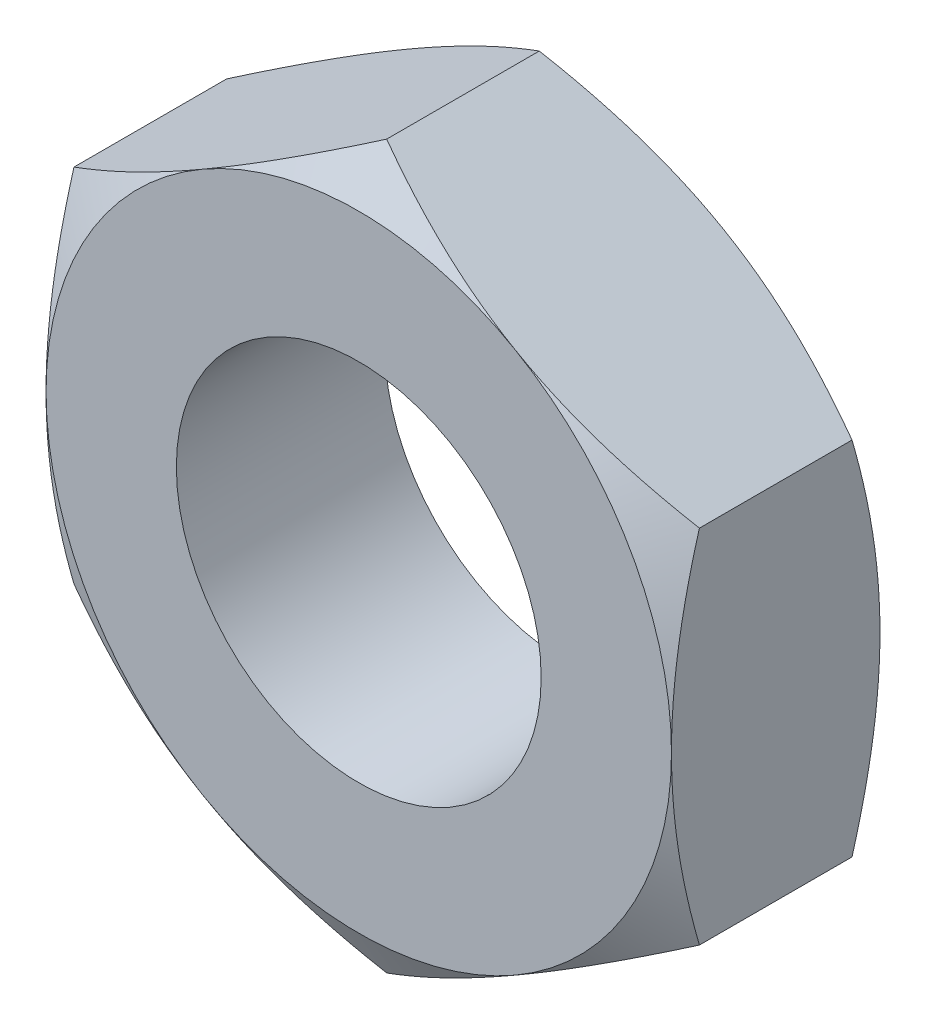
ISO-10303-21;
HEADER;
FILE_DESCRIPTION(('STEP AP214'),'2;1');
FILE_NAME('part.step','',(''),(''),'','','');
FILE_SCHEMA(('AUTOMOTIVE_DESIGN { 1 0 10303 214 1 1 1 1 }'));
ENDSEC;
DATA;
#1=APPLICATION_CONTEXT('core data for automotive mechanical design processes');
#2=APPLICATION_PROTOCOL_DEFINITION('international standard','automotive_design',2000,#1);
#3=PRODUCT_CONTEXT('',#1,'mechanical');
#4=PRODUCT('Part','Part','',(#3));
#5=PRODUCT_RELATED_PRODUCT_CATEGORY('part','',(#4));
#6=PRODUCT_DEFINITION_FORMATION('','',#4);
#7=PRODUCT_DEFINITION_CONTEXT('part definition',#1,'design');
#8=PRODUCT_DEFINITION('design','',#6,#7);
#9=PRODUCT_DEFINITION_SHAPE('','',#8);
#10=(LENGTH_UNIT() NAMED_UNIT(*) SI_UNIT(.MILLI.,.METRE.));
#11=(NAMED_UNIT(*) PLANE_ANGLE_UNIT() SI_UNIT($,.RADIAN.));
#12=(NAMED_UNIT(*) SI_UNIT($,.STERADIAN.) SOLID_ANGLE_UNIT());
#13=UNCERTAINTY_MEASURE_WITH_UNIT(LENGTH_MEASURE(1.E-05),#10,'distance_accuracy_value','');
#14=(GEOMETRIC_REPRESENTATION_CONTEXT(3) GLOBAL_UNCERTAINTY_ASSIGNED_CONTEXT((#13)) GLOBAL_UNIT_ASSIGNED_CONTEXT((#10,
#11,#12)) REPRESENTATION_CONTEXT('',''));
#15=CARTESIAN_POINT('',(0.,0.,0.));
#16=DIRECTION('',(0.,0.,1.));
#17=DIRECTION('',(1.,0.,0.));
#18=AXIS2_PLACEMENT_3D('',#15,#16,#17);
#19=CARTESIAN_POINT('',(0.,0.,-1.));
#20=DIRECTION('',(0.,0.,1.));
#21=DIRECTION('',(1.,0.,0.));
#22=AXIS2_PLACEMENT_3D('',#19,#20,#21);
#23=PLANE('',#22);
#24=CARTESIAN_POINT('',(0.,0.,-1.));
#25=DIRECTION('',(0.,0.,1.));
#26=DIRECTION('',(1.,0.,0.));
#27=AXIS2_PLACEMENT_3D('',#24,#25,#26);
#28=CIRCLE('',#27,1.75);
#29=CARTESIAN_POINT('',(1.75,0.,-1.));
#30=VERTEX_POINT('',#29);
#31=EDGE_CURVE('E250',#30,#30,#28,.T.);
#32=ORIENTED_EDGE('',*,*,#31,.T.);
#33=EDGE_LOOP('',(#32));
#34=FACE_BOUND('',#33,.T.);
#35=CARTESIAN_POINT('',(0.,0.,-1.));
#36=DIRECTION('',(0.,0.,1.));
#37=DIRECTION('',(1.,0.,0.));
#38=AXIS2_PLACEMENT_3D('',#35,#36,#37);
#39=CIRCLE('',#38,3.);
#40=CARTESIAN_POINT('',(3.,0.,-1.));
#41=VERTEX_POINT('',#40);
#42=CARTESIAN_POINT('',(1.5,2.59807621135332,-1.));
#43=VERTEX_POINT('',#42);
#44=EDGE_CURVE('E131',#41,#43,#39,.T.);
#45=ORIENTED_EDGE('',*,*,#44,.F.);
#46=CARTESIAN_POINT('',(0.,0.,-1.));
#47=DIRECTION('',(0.,0.,1.));
#48=DIRECTION('',(1.,0.,0.));
#49=AXIS2_PLACEMENT_3D('',#46,#47,#48);
#50=CIRCLE('',#49,3.);
#51=CARTESIAN_POINT('',(1.5,-2.59807621135332,-1.));
#52=VERTEX_POINT('',#51);
#53=EDGE_CURVE('E12',#41,#52,#50,.F.);
#54=ORIENTED_EDGE('',*,*,#53,.T.);
#55=CARTESIAN_POINT('',(-1.5,-2.59807621135332,-1.));
#56=VERTEX_POINT('',#55);
#57=EDGE_CURVE('E43',#52,#56,#50,.F.);
#58=ORIENTED_EDGE('',*,*,#57,.T.);
#59=CARTESIAN_POINT('',(-3.,0.,-1.));
#60=VERTEX_POINT('',#59);
#61=EDGE_CURVE('E309',#56,#60,#50,.F.);
#62=ORIENTED_EDGE('',*,*,#61,.T.);
#63=CARTESIAN_POINT('',(-1.5,2.59807621135332,-1.));
#64=VERTEX_POINT('',#63);
#65=EDGE_CURVE('E143',#60,#64,#50,.F.);
#66=ORIENTED_EDGE('',*,*,#65,.T.);
#67=EDGE_CURVE('E44',#64,#43,#50,.F.);
#68=ORIENTED_EDGE('',*,*,#67,.T.);
#69=EDGE_LOOP('',(#45,#54,#58,#62,#66,#68));
#70=FACE_BOUND('',#69,.T.);
#71=ADVANCED_FACE('F34',(#34,#70),#23,.F.);
#72=CARTESIAN_POINT('',(0.,0.,1.));
#73=DIRECTION('',(0.,0.,1.));
#74=DIRECTION('',(1.,0.,0.));
#75=AXIS2_PLACEMENT_3D('',#72,#73,#74);
#76=PLANE('',#75);
#77=CARTESIAN_POINT('',(0.,0.,1.));
#78=DIRECTION('',(0.,0.,1.));
#79=DIRECTION('',(1.,0.,0.));
#80=AXIS2_PLACEMENT_3D('',#77,#78,#79);
#81=CIRCLE('',#80,1.75);
#82=CARTESIAN_POINT('',(1.75,0.,1.));
#83=VERTEX_POINT('',#82);
#84=EDGE_CURVE('E246',#83,#83,#81,.T.);
#85=ORIENTED_EDGE('',*,*,#84,.F.);
#86=EDGE_LOOP('',(#85));
#87=FACE_BOUND('',#86,.T.);
#88=CARTESIAN_POINT('',(0.,0.,1.));
#89=DIRECTION('',(0.,0.,1.));
#90=DIRECTION('',(1.,0.,0.));
#91=AXIS2_PLACEMENT_3D('',#88,#89,#90);
#92=CIRCLE('',#91,3.);
#93=CARTESIAN_POINT('',(1.5,-2.59807621135332,1.));
#94=VERTEX_POINT('',#93);
#95=CARTESIAN_POINT('',(3.,0.,1.));
#96=VERTEX_POINT('',#95);
#97=EDGE_CURVE('E291',#94,#96,#92,.T.);
#98=ORIENTED_EDGE('',*,*,#97,.T.);
#99=CARTESIAN_POINT('',(1.5,2.59807621135332,1.));
#100=VERTEX_POINT('',#99);
#101=EDGE_CURVE('E280',#96,#100,#92,.T.);
#102=ORIENTED_EDGE('',*,*,#101,.T.);
#103=CARTESIAN_POINT('',(-1.5,2.59807621135332,1.));
#104=VERTEX_POINT('',#103);
#105=EDGE_CURVE('E284',#100,#104,#92,.T.);
#106=ORIENTED_EDGE('',*,*,#105,.T.);
#107=CARTESIAN_POINT('',(-3.,0.,1.));
#108=VERTEX_POINT('',#107);
#109=EDGE_CURVE('E288',#104,#108,#92,.T.);
#110=ORIENTED_EDGE('',*,*,#109,.T.);
#111=CARTESIAN_POINT('',(-1.5,-2.59807621135332,1.));
#112=VERTEX_POINT('',#111);
#113=EDGE_CURVE('E294',#108,#112,#92,.T.);
#114=ORIENTED_EDGE('',*,*,#113,.T.);
#115=EDGE_CURVE('E293',#112,#94,#92,.T.);
#116=ORIENTED_EDGE('',*,*,#115,.T.);
#117=EDGE_LOOP('',(#98,#102,#106,#110,#114,#116));
#118=FACE_BOUND('',#117,.T.);
#119=ADVANCED_FACE('F289',(#87,#118),#76,.T.);
#120=CARTESIAN_POINT('',(0.,3.46410161513776,1.));
#121=DIRECTION('',(0.5,-0.866025403784439,0.));
#122=DIRECTION('',(0.866025403784438,0.5,0.));
#123=AXIS2_PLACEMENT_3D('',#120,#121,#122);
#124=PLANE('',#123);
#125=DIRECTION('',(0.,0.,-1.));
#126=VECTOR('',#125,1.);
#127=CARTESIAN_POINT('',(0.,3.46410161513776,1.));
#128=LINE('',#127,#126);
#129=CARTESIAN_POINT('',(0.,3.46410161513776,0.732050807568878));
#130=VERTEX_POINT('',#129);
#131=CARTESIAN_POINT('',(0.,3.46410161513776,-0.732050807568878));
#132=VERTEX_POINT('',#131);
#133=EDGE_CURVE('E249',#130,#132,#128,.T.);
#134=ORIENTED_EDGE('',*,*,#133,.T.);
#135=CARTESIAN_POINT('',(0.000200000000000336,3.4642170851916,-0.731984137568989));
#136=CARTESIAN_POINT('',(-0.131635206588332,3.38810199317915,-0.775946295547693));
#137=CARTESIAN_POINT('',(-0.264608405355249,3.31132988107607,-0.815928413707371));
#138=CARTESIAN_POINT('',(-0.532857420002055,3.15645624025988,-0.885717919554534));
#139=CARTESIAN_POINT('',(-0.668138002634341,3.078351959461,-0.915500617734619));
#140=CARTESIAN_POINT('',(-0.937022602096483,2.92311136358059,-0.961862160788745));
#141=CARTESIAN_POINT('',(-1.07058524542946,2.84599893549862,-0.97874955887705));
#142=CARTESIAN_POINT('',(-1.33833905729569,2.6914112001411,-0.998910357551475));
#143=CARTESIAN_POINT('',(-1.47252925247984,2.61393645482892,-1.00220045221892));
#144=CARTESIAN_POINT('',(-1.72327559769581,2.46916798492017,-0.995359469114609));
#145=CARTESIAN_POINT('',(-1.83986926497268,2.40185259973206,-0.986908085807383));
#146=CARTESIAN_POINT('',(-2.07229698497464,2.2676603930218,-0.960121056992965));
#147=CARTESIAN_POINT('',(-2.18813023365133,2.2007840357172,-0.941776259138288));
#148=CARTESIAN_POINT('',(-2.42103725705637,2.06631510305815,-0.895915249146673));
#149=CARTESIAN_POINT('',(-2.53808155051394,1.99873954872331,-0.868204614736918));
#150=CARTESIAN_POINT('',(-2.77042435049913,1.86459637060759,-0.8053122048626));
#151=CARTESIAN_POINT('',(-2.88572583417111,1.79802702797161,-0.770145208978444));
#152=CARTESIAN_POINT('',(-3.0002,1.73193533751504,-0.73198413756899));
#153=B_SPLINE_CURVE_WITH_KNOTS('',3,(#135,#136,#137,#138,#139,#140,#141,#142,#143,#144,#145,
#146,#147,#148,#149,#150,#151,#152),.UNSPECIFIED.,.F.,.F.,(4,2,2,2,2,2,2,2,4),(0.,
0.47553983010304,0.952222784107964,1.41710776961288,1.88142182298026,2.28572436316091,
2.69040156475039,3.10405572063576,3.5168974940707),.UNSPECIFIED.);
#154=EDGE_CURVE('E57',#132,#64,#153,.T.);
#155=ORIENTED_EDGE('',*,*,#154,.T.);
#156=CARTESIAN_POINT('',(-3.,1.73205080756888,-0.732050807568879));
#157=VERTEX_POINT('',#156);
#158=EDGE_CURVE('E176',#64,#157,#153,.T.);
#159=ORIENTED_EDGE('',*,*,#158,.T.);
#160=DIRECTION('',(0.,0.,-1.));
#161=VECTOR('',#160,1.);
#162=CARTESIAN_POINT('',(-3.,1.73205080756888,1.));
#163=LINE('',#162,#161);
#164=CARTESIAN_POINT('',(-3.,1.73205080756888,0.732050807568879));
#165=VERTEX_POINT('',#164);
#166=EDGE_CURVE('E264',#165,#157,#163,.T.);
#167=ORIENTED_EDGE('',*,*,#166,.F.);
#168=CARTESIAN_POINT('',(0.000200000000000336,3.4642170851916,0.731984137568989));
#169=CARTESIAN_POINT('',(-0.131635206588332,3.38810199317915,0.775946295547693));
#170=CARTESIAN_POINT('',(-0.264608405355249,3.31132988107607,0.815928413707371));
#171=CARTESIAN_POINT('',(-0.532857420002055,3.15645624025988,0.885717919554534));
#172=CARTESIAN_POINT('',(-0.668138002634341,3.078351959461,0.915500617734619));
#173=CARTESIAN_POINT('',(-0.937022602096483,2.92311136358059,0.961862160788745));
#174=CARTESIAN_POINT('',(-1.07058524542946,2.84599893549862,0.97874955887705));
#175=CARTESIAN_POINT('',(-1.33833905729569,2.6914112001411,0.998910357551475));
#176=CARTESIAN_POINT('',(-1.47252925247984,2.61393645482892,1.00220045221892));
#177=CARTESIAN_POINT('',(-1.72327559769581,2.46916798492017,0.995359469114609));
#178=CARTESIAN_POINT('',(-1.83986926497268,2.40185259973206,0.986908085807383));
#179=CARTESIAN_POINT('',(-2.07229698497464,2.2676603930218,0.960121056992965));
#180=CARTESIAN_POINT('',(-2.18813023365133,2.2007840357172,0.941776259138288));
#181=CARTESIAN_POINT('',(-2.42103725705637,2.06631510305815,0.895915249146673));
#182=CARTESIAN_POINT('',(-2.53808155051394,1.99873954872331,0.868204614736918));
#183=CARTESIAN_POINT('',(-2.77042435049913,1.86459637060759,0.8053122048626));
#184=CARTESIAN_POINT('',(-2.88572583417111,1.79802702797161,0.770145208978444));
#185=CARTESIAN_POINT('',(-3.0002,1.73193533751504,0.73198413756899));
#186=B_SPLINE_CURVE_WITH_KNOTS('',3,(#168,#169,#170,#171,#172,#173,#174,#175,#176,#177,#178,
#179,#180,#181,#182,#183,#184,#185),.UNSPECIFIED.,.F.,.F.,(4,2,2,2,2,2,2,2,4),(0.,
0.47553983010304,0.952222784107964,1.41710776961288,1.88142182298026,2.28572436316091,
2.69040156475039,3.10405572063576,3.5168974940707),.UNSPECIFIED.);
#187=EDGE_CURVE('E239',#104,#165,#186,.T.);
#188=ORIENTED_EDGE('',*,*,#187,.F.);
#189=EDGE_CURVE('E245',#130,#104,#186,.T.);
#190=ORIENTED_EDGE('',*,*,#189,.F.);
#191=EDGE_LOOP('',(#134,#155,#159,#167,#188,#190));
#192=FACE_BOUND('',#191,.T.);
#193=ADVANCED_FACE('F36',(#192),#124,.F.);
#194=CARTESIAN_POINT('',(-3.,1.73205080756888,1.));
#195=DIRECTION('',(1.,0.,0.));
#196=DIRECTION('',(0.,0.,-1.));
#197=AXIS2_PLACEMENT_3D('',#194,#195,#196);
#198=PLANE('',#197);
#199=ORIENTED_EDGE('',*,*,#166,.T.);
#200=CARTESIAN_POINT('',(-3.,5.73225080756888,1.00330724402733));
#201=CARTESIAN_POINT('',(-3.,5.59799811373669,0.934642371261054));
#202=CARTESIAN_POINT('',(-3.,5.46354106552018,0.866373419250439));
#203=CARTESIAN_POINT('',(-3.,5.19412594711896,0.730824802249696));
#204=CARTESIAN_POINT('',(-3.,5.05916786634262,0.663545158324029));
#205=CARTESIAN_POINT('',(-3.,4.78843231789163,0.530061275912581));
#206=CARTESIAN_POINT('',(-3.,4.65265384244875,0.463859077660899));
#207=CARTESIAN_POINT('',(-3.,4.38038885038152,0.332919444746281));
#208=CARTESIAN_POINT('',(-3.,4.24390232345014,0.268182031480014));
#209=CARTESIAN_POINT('',(-3.,3.96310511366176,0.137269247609245));
#210=CARTESIAN_POINT('',(-3.,3.81875010473635,0.0711886726884405));
#211=CARTESIAN_POINT('',(-3.,3.52890389215656,-0.0584292872796516));
#212=CARTESIAN_POINT('',(-3.,3.38341272129836,-0.12196674541402));
#213=CARTESIAN_POINT('',(-3.,3.0911428032025,-0.245735184768926));
#214=CARTESIAN_POINT('',(-3.,2.94436502804428,-0.305968448279415));
#215=CARTESIAN_POINT('',(-3.,2.64909731827644,-0.422212945868511));
#216=CARTESIAN_POINT('',(-3.,2.50060697487877,-0.478223146808592));
#217=CARTESIAN_POINT('',(-3.,2.17495473766773,-0.59420348606466));
#218=CARTESIAN_POINT('',(-3.,1.99740334689548,-0.653097748112464));
#219=CARTESIAN_POINT('',(-3.,1.63917764376158,-0.760295234190063));
#220=CARTESIAN_POINT('',(-3.,1.45850503366086,-0.808604046144594));
#221=CARTESIAN_POINT('',(-3.,1.09720914532956,-0.89023263279609));
#222=CARTESIAN_POINT('',(-3.,0.916647599895755,-0.923814776936984));
#223=CARTESIAN_POINT('',(-3.,0.644079261802785,-0.961267421766915));
#224=CARTESIAN_POINT('',(-3.,0.552943422867091,-0.971597873778783));
#225=CARTESIAN_POINT('',(-3.,0.370270654947725,-0.987634546000518));
#226=CARTESIAN_POINT('',(-3.,0.278733786435307,-0.993341440798006));
#227=CARTESIAN_POINT('',(-3.,0.0944078517722058,-0.999966148542618));
#228=CARTESIAN_POINT('',(-3.,0.00161671746075725,-1.0008268616344));
#229=CARTESIAN_POINT('',(-3.,-0.183877598413804,-0.997575255627967));
#230=CARTESIAN_POINT('',(-3.,-0.276580779686971,-0.993462920192288));
#231=CARTESIAN_POINT('',(-3.,-0.461668088480518,-0.980413707671682));
#232=CARTESIAN_POINT('',(-3.,-0.554052127589446,-0.971475587116072));
#233=CARTESIAN_POINT('',(-3.,-0.738276464049777,-0.949081983530696));
#234=CARTESIAN_POINT('',(-3.,-0.830116673244046,-0.935625787456255));
#235=CARTESIAN_POINT('',(-3.,-1.1081241349506,-0.888486783456532));
#236=CARTESIAN_POINT('',(-3.,-1.2932028927465,-0.848310835169218));
#237=CARTESIAN_POINT('',(-3.,-1.65992833453579,-0.754833040913917));
#238=CARTESIAN_POINT('',(-3.,-1.8415742184766,-0.701528174816905));
#239=CARTESIAN_POINT('',(-3.,-2.18718321983853,-0.590014821703022));
#240=CARTESIAN_POINT('',(-3.,-2.35139002090274,-0.532549608867383));
#241=CARTESIAN_POINT('',(-3.,-2.67757637701536,-0.411577705935765));
#242=CARTESIAN_POINT('',(-3.,-2.83955548471668,-0.348069822103828));
#243=CARTESIAN_POINT('',(-3.,-3.16180541641892,-0.216496689958477));
#244=CARTESIAN_POINT('',(-3.,-3.32207460435457,-0.148427463983224));
#245=CARTESIAN_POINT('',(-3.,-3.64112437712565,-0.00888164672136602));
#246=CARTESIAN_POINT('',(-3.,-3.79990488959462,0.0625951091925737));
#247=CARTESIAN_POINT('',(-3.,-4.10783154121877,0.20427958485193));
#248=CARTESIAN_POINT('',(-3.,-4.25704019529893,0.274351956999876));
#249=CARTESIAN_POINT('',(-3.,-4.55457880885657,0.416344812707701));
#250=CARTESIAN_POINT('',(-3.,-4.70290874355283,0.488265348086155));
#251=CARTESIAN_POINT('',(-3.,-4.99841900754647,0.633369142757194));
#252=CARTESIAN_POINT('',(-3.,-5.14560141584992,0.706548177644908));
#253=CARTESIAN_POINT('',(-3.,-5.43935321353677,0.854098470573744));
#254=CARTESIAN_POINT('',(-3.,-5.58592265068707,0.928469633447959));
#255=CARTESIAN_POINT('',(-3.,-5.73225080756888,1.00330724402733));
#256=B_SPLINE_CURVE_WITH_KNOTS('',3,(#200,#201,#202,#203,#204,#205,#206,#207,#208,#209,#210,
#211,#212,#213,#214,#215,#216,#217,#218,#219,#220,#221,#222,#223,#224,#225,#226,#227,#228,#229,
#230,#231,#232,#233,#234,#235,#236,#237,#238,#239,#240,#241,#242,#243,#244,#245,#246,#247,#248,
#249,#250,#251,#252,#253,#254,#255),.UNSPECIFIED.,.F.,.F.,(4,2,2,2,2,2,2,2,2,2,2,2,2,2,2,2,2,2,
2,2,2,2,2,2,2,2,2,4),(0.,0.452382016001322,0.904773650265349,1.35794045354517,1.81111387213612,
2.2873771437625,2.76362671813268,3.23954308217786,3.71557550010852,4.27652369616462,
4.83717505756687,5.38738613645125,5.66244417939779,5.93746208351301,6.21571369559987,
6.4939662218021,6.77229048018743,7.05065868449288,7.61810965270508,8.18569127741244,
8.70745206667822,9.2293161451901,9.75164138486645,10.2739918851653,10.7685068932809,
11.2630357817083,11.756143015984,12.2492110799155),.UNSPECIFIED.);
#257=EDGE_CURVE('E297',#157,#60,#256,.T.);
#258=ORIENTED_EDGE('',*,*,#257,.T.);
#259=CARTESIAN_POINT('',(-3.,-1.73205080756888,-0.732050807568879));
#260=VERTEX_POINT('',#259);
#261=EDGE_CURVE('E202',#60,#260,#256,.T.);
#262=ORIENTED_EDGE('',*,*,#261,.T.);
#263=DIRECTION('',(0.,0.,-1.));
#264=VECTOR('',#263,1.);
#265=CARTESIAN_POINT('',(-3.,-1.73205080756888,1.));
#266=LINE('',#265,#264);
#267=CARTESIAN_POINT('',(-3.,-1.73205080756888,0.732050807568879));
#268=VERTEX_POINT('',#267);
#269=EDGE_CURVE('E261',#268,#260,#266,.T.);
#270=ORIENTED_EDGE('',*,*,#269,.F.);
#271=CARTESIAN_POINT('',(-3.,5.73225080756888,-1.00330724402733));
#272=CARTESIAN_POINT('',(-3.,5.59799811373669,-0.934642371261054));
#273=CARTESIAN_POINT('',(-3.,5.46354106552018,-0.86637341925044));
#274=CARTESIAN_POINT('',(-3.,5.19412594711896,-0.730824802249697));
#275=CARTESIAN_POINT('',(-3.,5.05916786634262,-0.66354515832403));
#276=CARTESIAN_POINT('',(-3.,4.78843231789163,-0.530061275912582));
#277=CARTESIAN_POINT('',(-3.,4.65265384244875,-0.4638590776609));
#278=CARTESIAN_POINT('',(-3.,4.38038885038152,-0.332919444746282));
#279=CARTESIAN_POINT('',(-3.,4.24390232345015,-0.268182031480015));
#280=CARTESIAN_POINT('',(-3.,3.96310511366176,-0.137269247609246));
#281=CARTESIAN_POINT('',(-3.,3.81875010473635,-0.0711886726884412));
#282=CARTESIAN_POINT('',(-3.,3.52890389215656,0.0584292872796511));
#283=CARTESIAN_POINT('',(-3.,3.38341272129836,0.121966745414019));
#284=CARTESIAN_POINT('',(-3.,3.0911428032025,0.245735184768925));
#285=CARTESIAN_POINT('',(-3.,2.94436502804428,0.305968448279415));
#286=CARTESIAN_POINT('',(-3.,2.64909731827644,0.422212945868511));
#287=CARTESIAN_POINT('',(-3.,2.50060697487877,0.478223146808591));
#288=CARTESIAN_POINT('',(-3.,2.17495473766773,0.59420348606466));
#289=CARTESIAN_POINT('',(-3.,1.99740334689548,0.653097748112464));
#290=CARTESIAN_POINT('',(-3.,1.63917764376158,0.760295234190062));
#291=CARTESIAN_POINT('',(-3.,1.45850503366086,0.808604046144594));
#292=CARTESIAN_POINT('',(-3.,1.09720914532956,0.89023263279609));
#293=CARTESIAN_POINT('',(-3.,0.916647599895756,0.923814776936984));
#294=CARTESIAN_POINT('',(-3.,0.644079261802786,0.961267421766915));
#295=CARTESIAN_POINT('',(-3.,0.552943422867093,0.971597873778783));
#296=CARTESIAN_POINT('',(-3.,0.370270654947727,0.987634546000518));
#297=CARTESIAN_POINT('',(-3.,0.278733786435309,0.993341440798006));
#298=CARTESIAN_POINT('',(-3.,0.0944078517722077,0.999966148542618));
#299=CARTESIAN_POINT('',(-3.,0.00161671746075912,1.0008268616344));
#300=CARTESIAN_POINT('',(-3.,-0.183877598413802,0.997575255627967));
#301=CARTESIAN_POINT('',(-3.,-0.276580779686969,0.993462920192288));
#302=CARTESIAN_POINT('',(-3.,-0.461668088480515,0.980413707671682));
#303=CARTESIAN_POINT('',(-3.,-0.554052127589443,0.971475587116072));
#304=CARTESIAN_POINT('',(-3.,-0.738276464049774,0.949081983530696));
#305=CARTESIAN_POINT('',(-3.,-0.830116673244043,0.935625787456255));
#306=CARTESIAN_POINT('',(-3.,-1.1081241349506,0.888486783456533));
#307=CARTESIAN_POINT('',(-3.,-1.29320289274649,0.848310835169219));
#308=CARTESIAN_POINT('',(-3.,-1.65992833453579,0.754833040913918));
#309=CARTESIAN_POINT('',(-3.,-1.8415742184766,0.701528174816906));
#310=CARTESIAN_POINT('',(-3.,-2.18718321983853,0.590014821703023));
#311=CARTESIAN_POINT('',(-3.,-2.35139002090274,0.532549608867384));
#312=CARTESIAN_POINT('',(-3.,-2.67757637701536,0.411577705935765));
#313=CARTESIAN_POINT('',(-3.,-2.83955548471668,0.348069822103828));
#314=CARTESIAN_POINT('',(-3.,-3.16180541641892,0.216496689958478));
#315=CARTESIAN_POINT('',(-3.,-3.32207460435457,0.148427463983225));
#316=CARTESIAN_POINT('',(-3.,-3.64112437712565,0.0088816467213664));
#317=CARTESIAN_POINT('',(-3.,-3.79990488959462,-0.0625951091925736));
#318=CARTESIAN_POINT('',(-3.,-4.10783154121877,-0.20427958485193));
#319=CARTESIAN_POINT('',(-3.,-4.25704019529893,-0.274351956999876));
#320=CARTESIAN_POINT('',(-3.,-4.55457880885657,-0.416344812707701));
#321=CARTESIAN_POINT('',(-3.,-4.70290874355283,-0.488265348086155));
#322=CARTESIAN_POINT('',(-3.,-4.99841900754647,-0.633369142757194));
#323=CARTESIAN_POINT('',(-3.,-5.14560141584992,-0.706548177644908));
#324=CARTESIAN_POINT('',(-3.,-5.43935321353677,-0.854098470573743));
#325=CARTESIAN_POINT('',(-3.,-5.58592265068707,-0.928469633447959));
#326=CARTESIAN_POINT('',(-3.,-5.73225080756888,-1.00330724402733));
#327=B_SPLINE_CURVE_WITH_KNOTS('',3,(#271,#272,#273,#274,#275,#276,#277,#278,#279,#280,#281,
#282,#283,#284,#285,#286,#287,#288,#289,#290,#291,#292,#293,#294,#295,#296,#297,#298,#299,#300,
#301,#302,#303,#304,#305,#306,#307,#308,#309,#310,#311,#312,#313,#314,#315,#316,#317,#318,#319,
#320,#321,#322,#323,#324,#325,#326),.UNSPECIFIED.,.F.,.F.,(4,2,2,2,2,2,2,2,2,2,2,2,2,2,2,2,2,2,
2,2,2,2,2,2,2,2,2,4),(0.,0.45238201600132,0.904773650265347,1.35794045354517,1.81111387213612,
2.2873771437625,2.76362671813267,3.23954308217786,3.71557550010852,4.27652369616462,
4.83717505756687,5.38738613645124,5.66244417939779,5.937462083513,6.21571369559986,
6.4939662218021,6.77229048018743,7.05065868449287,7.61810965270507,8.18569127741243,
8.70745206667822,9.2293161451901,9.75164138486645,10.2739918851653,10.7685068932809,
11.2630357817083,11.756143015984,12.2492110799155),.UNSPECIFIED.);
#328=EDGE_CURVE('E232',#108,#268,#327,.T.);
#329=ORIENTED_EDGE('',*,*,#328,.F.);
#330=EDGE_CURVE('E238',#165,#108,#327,.T.);
#331=ORIENTED_EDGE('',*,*,#330,.F.);
#332=EDGE_LOOP('',(#199,#258,#262,#270,#329,#331));
#333=FACE_BOUND('',#332,.T.);
#334=ADVANCED_FACE('F211',(#333),#198,.F.);
#335=CARTESIAN_POINT('',(-3.,-1.73205080756888,1.));
#336=DIRECTION('',(0.5,0.866025403784438,0.));
#337=DIRECTION('',(-0.866025403784439,0.5,0.));
#338=AXIS2_PLACEMENT_3D('',#335,#336,#337);
#339=PLANE('',#338);
#340=ORIENTED_EDGE('',*,*,#269,.T.);
#341=CARTESIAN_POINT('',(-3.0002,-1.73193533751504,-0.73198413756899));
#342=CARTESIAN_POINT('',(-2.86836479341167,-1.80805042952748,-0.775946295547694));
#343=CARTESIAN_POINT('',(-2.73539159464475,-1.88482254163057,-0.815928413707372));
#344=CARTESIAN_POINT('',(-2.46714257999795,-2.03969618244675,-0.885717919554534));
#345=CARTESIAN_POINT('',(-2.33186199736566,-2.11780046324563,-0.91550061773462));
#346=CARTESIAN_POINT('',(-2.06297739790352,-2.27304105912605,-0.961862160788745));
#347=CARTESIAN_POINT('',(-1.92941475457054,-2.35015348720802,-0.97874955887705));
#348=CARTESIAN_POINT('',(-1.66166094270431,-2.50474122256554,-0.998910357551476));
#349=CARTESIAN_POINT('',(-1.52747074752016,-2.58221596787771,-1.00220045221892));
#350=CARTESIAN_POINT('',(-1.27672440230419,-2.72698443778647,-0.995359469114609));
#351=CARTESIAN_POINT('',(-1.16013073502733,-2.79429982297457,-0.986908085807383));
#352=CARTESIAN_POINT('',(-0.927703015025365,-2.92849202968483,-0.960121056992965));
#353=CARTESIAN_POINT('',(-0.81186976634867,-2.99536838698943,-0.941776259138288));
#354=CARTESIAN_POINT('',(-0.578962742943633,-3.12983731964849,-0.895915249146673));
#355=CARTESIAN_POINT('',(-0.461918449486061,-3.19741287398332,-0.868204614736917));
#356=CARTESIAN_POINT('',(-0.229575649500877,-3.33155605209904,-0.805312204862599));
#357=CARTESIAN_POINT('',(-0.114274165828895,-3.39812539473502,-0.770145208978444));
#358=CARTESIAN_POINT('',(0.000199999999998306,-3.46421708519159,-0.73198413756899));
#359=B_SPLINE_CURVE_WITH_KNOTS('',3,(#341,#342,#343,#344,#345,#346,#347,#348,#349,#350,#351,
#352,#353,#354,#355,#356,#357,#358),.UNSPECIFIED.,.F.,.F.,(4,2,2,2,2,2,2,2,4),(0.,
0.475539830103041,0.952222784107964,1.41710776961288,1.88142182298026,2.28572436316091,
2.69040156475039,3.10405572063576,3.5168974940707),.UNSPECIFIED.);
#360=EDGE_CURVE('E200',#260,#56,#359,.T.);
#361=ORIENTED_EDGE('',*,*,#360,.T.);
#362=CARTESIAN_POINT('',(0.,-3.46410161513776,-0.732050807568879));
#363=VERTEX_POINT('',#362);
#364=EDGE_CURVE('E193',#56,#363,#359,.T.);
#365=ORIENTED_EDGE('',*,*,#364,.T.);
#366=DIRECTION('',(0.,0.,-1.));
#367=VECTOR('',#366,1.);
#368=CARTESIAN_POINT('',(0.,-3.46410161513776,1.));
#369=LINE('',#368,#367);
#370=CARTESIAN_POINT('',(0.,-3.46410161513776,0.732050807568879));
#371=VERTEX_POINT('',#370);
#372=EDGE_CURVE('E258',#371,#363,#369,.T.);
#373=ORIENTED_EDGE('',*,*,#372,.F.);
#374=CARTESIAN_POINT('',(-3.0002,-1.73193533751504,0.73198413756899));
#375=CARTESIAN_POINT('',(-2.86836479341167,-1.80805042952748,0.775946295547694));
#376=CARTESIAN_POINT('',(-2.73539159464475,-1.88482254163057,0.815928413707372));
#377=CARTESIAN_POINT('',(-2.46714257999795,-2.03969618244675,0.885717919554534));
#378=CARTESIAN_POINT('',(-2.33186199736566,-2.11780046324563,0.91550061773462));
#379=CARTESIAN_POINT('',(-2.06297739790352,-2.27304105912605,0.961862160788745));
#380=CARTESIAN_POINT('',(-1.92941475457054,-2.35015348720802,0.97874955887705));
#381=CARTESIAN_POINT('',(-1.66166094270431,-2.50474122256554,0.998910357551476));
#382=CARTESIAN_POINT('',(-1.52747074752016,-2.58221596787771,1.00220045221892));
#383=CARTESIAN_POINT('',(-1.27672440230419,-2.72698443778647,0.995359469114609));
#384=CARTESIAN_POINT('',(-1.16013073502733,-2.79429982297457,0.986908085807383));
#385=CARTESIAN_POINT('',(-0.927703015025365,-2.92849202968483,0.960121056992965));
#386=CARTESIAN_POINT('',(-0.81186976634867,-2.99536838698943,0.941776259138288));
#387=CARTESIAN_POINT('',(-0.578962742943633,-3.12983731964849,0.895915249146673));
#388=CARTESIAN_POINT('',(-0.461918449486061,-3.19741287398332,0.868204614736917));
#389=CARTESIAN_POINT('',(-0.229575649500877,-3.33155605209904,0.805312204862599));
#390=CARTESIAN_POINT('',(-0.114274165828895,-3.39812539473502,0.770145208978444));
#391=CARTESIAN_POINT('',(0.000199999999998306,-3.46421708519159,0.73198413756899));
#392=B_SPLINE_CURVE_WITH_KNOTS('',3,(#374,#375,#376,#377,#378,#379,#380,#381,#382,#383,#384,
#385,#386,#387,#388,#389,#390,#391),.UNSPECIFIED.,.F.,.F.,(4,2,2,2,2,2,2,2,4),(0.,
0.475539830103041,0.952222784107964,1.41710776961288,1.88142182298026,2.28572436316091,
2.69040156475039,3.10405572063576,3.5168974940707),.UNSPECIFIED.);
#393=EDGE_CURVE('E217',#112,#371,#392,.T.);
#394=ORIENTED_EDGE('',*,*,#393,.F.);
#395=EDGE_CURVE('E224',#268,#112,#392,.T.);
#396=ORIENTED_EDGE('',*,*,#395,.F.);
#397=EDGE_LOOP('',(#340,#361,#365,#373,#394,#396));
#398=FACE_BOUND('',#397,.T.);
#399=ADVANCED_FACE('F207',(#398),#339,.F.);
#400=CARTESIAN_POINT('',(0.,-3.46410161513776,1.));
#401=DIRECTION('',(-0.5,0.866025403784438,0.));
#402=DIRECTION('',(-0.866025403784438,-0.5,0.));
#403=AXIS2_PLACEMENT_3D('',#400,#401,#402);
#404=PLANE('',#403);
#405=ORIENTED_EDGE('',*,*,#372,.T.);
#406=CARTESIAN_POINT('',(-0.000200000000001768,-3.46421708519159,-0.73198413756899));
#407=CARTESIAN_POINT('',(0.13163520658833,-3.38810199317915,-0.775946295547694));
#408=CARTESIAN_POINT('',(0.264608405355247,-3.31132988107607,-0.815928413707372));
#409=CARTESIAN_POINT('',(0.532857420002054,-3.15645624025988,-0.885717919554535));
#410=CARTESIAN_POINT('',(0.66813800263434,-3.078351959461,-0.91550061773462));
#411=CARTESIAN_POINT('',(0.937022602096481,-2.92311136358059,-0.961862160788746));
#412=CARTESIAN_POINT('',(1.07058524542946,-2.84599893549861,-0.978749558877051));
#413=CARTESIAN_POINT('',(1.33833905729569,-2.6914112001411,-0.998910357551477));
#414=CARTESIAN_POINT('',(1.47252925247984,-2.61393645482892,-1.00220045221892));
#415=CARTESIAN_POINT('',(1.7232755976958,-2.46916798492017,-0.995359469114611));
#416=CARTESIAN_POINT('',(1.83986926497267,-2.40185259973206,-0.986908085807385));
#417=CARTESIAN_POINT('',(2.07229698497463,-2.2676603930218,-0.960121056992966));
#418=CARTESIAN_POINT('',(2.18813023365133,-2.2007840357172,-0.941776259138289));
#419=CARTESIAN_POINT('',(2.42103725705636,-2.06631510305815,-0.895915249146675));
#420=CARTESIAN_POINT('',(2.53808155051394,-1.99873954872331,-0.86820461473692));
#421=CARTESIAN_POINT('',(2.77042435049912,-1.86459637060759,-0.805312204862602));
#422=CARTESIAN_POINT('',(2.8857258341711,-1.79802702797161,-0.770145208978447));
#423=CARTESIAN_POINT('',(3.0002,-1.73193533751504,-0.731984137568993));
#424=B_SPLINE_CURVE_WITH_KNOTS('',3,(#406,#407,#408,#409,#410,#411,#412,#413,#414,#415,#416,
#417,#418,#419,#420,#421,#422,#423),.UNSPECIFIED.,.F.,.F.,(4,2,2,2,2,2,2,2,4),(0.,
0.47553983010304,0.952222784107964,1.41710776961288,1.88142182298026,2.28572436316091,
2.69040156475039,3.10405572063576,3.5168974940707),.UNSPECIFIED.);
#425=EDGE_CURVE('E201',#363,#52,#424,.T.);
#426=ORIENTED_EDGE('',*,*,#425,.T.);
#427=CARTESIAN_POINT('',(3.,-1.73205080756888,-0.732050807568881));
#428=VERTEX_POINT('',#427);
#429=EDGE_CURVE('E186',#52,#428,#424,.T.);
#430=ORIENTED_EDGE('',*,*,#429,.T.);
#431=DIRECTION('',(0.,0.,-1.));
#432=VECTOR('',#431,1.);
#433=CARTESIAN_POINT('',(3.,-1.73205080756888,1.));
#434=LINE('',#433,#432);
#435=CARTESIAN_POINT('',(3.,-1.73205080756888,0.732050807568881));
#436=VERTEX_POINT('',#435);
#437=EDGE_CURVE('E255',#436,#428,#434,.T.);
#438=ORIENTED_EDGE('',*,*,#437,.F.);
#439=CARTESIAN_POINT('',(-0.000200000000001768,-3.46421708519159,0.73198413756899));
#440=CARTESIAN_POINT('',(0.13163520658833,-3.38810199317915,0.775946295547694));
#441=CARTESIAN_POINT('',(0.264608405355247,-3.31132988107607,0.815928413707372));
#442=CARTESIAN_POINT('',(0.532857420002054,-3.15645624025988,0.885717919554535));
#443=CARTESIAN_POINT('',(0.66813800263434,-3.078351959461,0.91550061773462));
#444=CARTESIAN_POINT('',(0.937022602096481,-2.92311136358059,0.961862160788746));
#445=CARTESIAN_POINT('',(1.07058524542946,-2.84599893549861,0.978749558877051));
#446=CARTESIAN_POINT('',(1.33833905729569,-2.6914112001411,0.998910357551477));
#447=CARTESIAN_POINT('',(1.47252925247984,-2.61393645482892,1.00220045221892));
#448=CARTESIAN_POINT('',(1.7232755976958,-2.46916798492017,0.995359469114611));
#449=CARTESIAN_POINT('',(1.83986926497267,-2.40185259973206,0.986908085807385));
#450=CARTESIAN_POINT('',(2.07229698497463,-2.2676603930218,0.960121056992966));
#451=CARTESIAN_POINT('',(2.18813023365133,-2.2007840357172,0.941776259138289));
#452=CARTESIAN_POINT('',(2.42103725705636,-2.06631510305815,0.895915249146675));
#453=CARTESIAN_POINT('',(2.53808155051394,-1.99873954872331,0.86820461473692));
#454=CARTESIAN_POINT('',(2.77042435049912,-1.86459637060759,0.805312204862602));
#455=CARTESIAN_POINT('',(2.8857258341711,-1.79802702797161,0.770145208978447));
#456=CARTESIAN_POINT('',(3.0002,-1.73193533751504,0.731984137568993));
#457=B_SPLINE_CURVE_WITH_KNOTS('',3,(#439,#440,#441,#442,#443,#444,#445,#446,#447,#448,#449,
#450,#451,#452,#453,#454,#455,#456),.UNSPECIFIED.,.F.,.F.,(4,2,2,2,2,2,2,2,4),(0.,
0.47553983010304,0.952222784107964,1.41710776961288,1.88142182298026,2.28572436316091,
2.69040156475039,3.10405572063576,3.5168974940707),.UNSPECIFIED.);
#458=EDGE_CURVE('E226',#94,#436,#457,.T.);
#459=ORIENTED_EDGE('',*,*,#458,.F.);
#460=EDGE_CURVE('E225',#371,#94,#457,.T.);
#461=ORIENTED_EDGE('',*,*,#460,.F.);
#462=EDGE_LOOP('',(#405,#426,#430,#438,#459,#461));
#463=FACE_BOUND('',#462,.T.);
#464=ADVANCED_FACE('F210',(#463),#404,.F.);
#465=CARTESIAN_POINT('',(3.,-1.73205080756888,1.));
#466=DIRECTION('',(-1.,0.,0.));
#467=DIRECTION('',(0.,-1.,0.));
#468=AXIS2_PLACEMENT_3D('',#465,#466,#467);
#469=PLANE('',#468);
#470=ORIENTED_EDGE('',*,*,#437,.T.);
#471=CARTESIAN_POINT('',(2.99999999999999,-5.73225080756888,1.00330724402733));
#472=CARTESIAN_POINT('',(2.99999999999999,-5.59799811373669,0.934642371261054));
#473=CARTESIAN_POINT('',(2.99999999999999,-5.46354106552018,0.866373419250439));
#474=CARTESIAN_POINT('',(2.99999999999999,-5.19412594711896,0.730824802249696));
#475=CARTESIAN_POINT('',(2.99999999999999,-5.05916786634262,0.663545158324029));
#476=CARTESIAN_POINT('',(2.99999999999999,-4.78843231789163,0.530061275912581));
#477=CARTESIAN_POINT('',(2.99999999999999,-4.65265384244875,0.4638590776609));
#478=CARTESIAN_POINT('',(2.99999999999999,-4.38038885038152,0.332919444746281));
#479=CARTESIAN_POINT('',(2.99999999999999,-4.24390232345015,0.268182031480013));
#480=CARTESIAN_POINT('',(2.99999999999999,-3.96310511366176,0.137269247609244));
#481=CARTESIAN_POINT('',(2.99999999999999,-3.81875010473635,0.07118867268844));
#482=CARTESIAN_POINT('',(2.99999999999999,-3.52890389215656,-0.0584292872796522));
#483=CARTESIAN_POINT('',(2.99999999999999,-3.38341272129836,-0.121966745414021));
#484=CARTESIAN_POINT('',(2.99999999999999,-3.0911428032025,-0.245735184768927));
#485=CARTESIAN_POINT('',(3.,-2.94436502804428,-0.305968448279416));
#486=CARTESIAN_POINT('',(3.,-2.64909731827644,-0.422212945868512));
#487=CARTESIAN_POINT('',(3.,-2.50060697487878,-0.478223146808592));
#488=CARTESIAN_POINT('',(3.,-2.17495473766774,-0.594203486064661));
#489=CARTESIAN_POINT('',(3.,-1.99740334689548,-0.653097748112465));
#490=CARTESIAN_POINT('',(3.,-1.63917764376159,-0.760295234190064));
#491=CARTESIAN_POINT('',(3.,-1.45850503366087,-0.808604046144595));
#492=CARTESIAN_POINT('',(3.,-1.09720914532956,-0.890232632796092));
#493=CARTESIAN_POINT('',(3.,-0.916647599895762,-0.923814776936986));
#494=CARTESIAN_POINT('',(3.,-0.644079261802792,-0.961267421766917));
#495=CARTESIAN_POINT('',(3.,-0.552943422867099,-0.971597873778785));
#496=CARTESIAN_POINT('',(3.,-0.370270654947732,-0.98763454600052));
#497=CARTESIAN_POINT('',(3.,-0.278733786435314,-0.993341440798007));
#498=CARTESIAN_POINT('',(3.,-0.0944078517722132,-0.99996614854262));
#499=CARTESIAN_POINT('',(3.,-0.00161671746076481,-1.0008268616344));
#500=CARTESIAN_POINT('',(3.,0.183877598413796,-0.997575255627969));
#501=CARTESIAN_POINT('',(3.,0.276580779686964,-0.993462920192291));
#502=CARTESIAN_POINT('',(3.,0.46166808848051,-0.980413707671685));
#503=CARTESIAN_POINT('',(3.,0.554052127589438,-0.971475587116075));
#504=CARTESIAN_POINT('',(3.,0.738276464049769,-0.949081983530699));
#505=CARTESIAN_POINT('',(3.,0.830116673244038,-0.935625787456258));
#506=CARTESIAN_POINT('',(3.,1.10812413495059,-0.888486783456536));
#507=CARTESIAN_POINT('',(3.,1.29320289274649,-0.848310835169222));
#508=CARTESIAN_POINT('',(3.,1.65992833453578,-0.754833040913921));
#509=CARTESIAN_POINT('',(3.,1.84157421847659,-0.70152817481691));
#510=CARTESIAN_POINT('',(3.,2.18718321983852,-0.590014821703027));
#511=CARTESIAN_POINT('',(3.,2.35139002090273,-0.532549608867387));
#512=CARTESIAN_POINT('',(3.,2.67757637701535,-0.411577705935769));
#513=CARTESIAN_POINT('',(3.,2.83955548471668,-0.348069822103832));
#514=CARTESIAN_POINT('',(3.,3.16180541641892,-0.216496689958481));
#515=CARTESIAN_POINT('',(3.,3.32207460435456,-0.148427463983227));
#516=CARTESIAN_POINT('',(3.,3.64112437712565,-0.00888164672136788));
#517=CARTESIAN_POINT('',(3.,3.79990488959461,0.0625951091925724));
#518=CARTESIAN_POINT('',(3.,4.10783154121877,0.204279584851929));
#519=CARTESIAN_POINT('',(3.,4.25704019529893,0.274351956999875));
#520=CARTESIAN_POINT('',(3.,4.55457880885657,0.416344812707701));
#521=CARTESIAN_POINT('',(3.,4.70290874355283,0.488265348086155));
#522=CARTESIAN_POINT('',(3.,4.99841900754648,0.633369142757194));
#523=CARTESIAN_POINT('',(3.,5.14560141584992,0.706548177644909));
#524=CARTESIAN_POINT('',(3.,5.43935321353678,0.854098470573745));
#525=CARTESIAN_POINT('',(3.,5.58592265068708,0.928469633447961));
#526=CARTESIAN_POINT('',(3.,5.73225080756888,1.00330724402733));
#527=B_SPLINE_CURVE_WITH_KNOTS('',3,(#471,#472,#473,#474,#475,#476,#477,#478,#479,#480,#481,
#482,#483,#484,#485,#486,#487,#488,#489,#490,#491,#492,#493,#494,#495,#496,#497,#498,#499,#500,
#501,#502,#503,#504,#505,#506,#507,#508,#509,#510,#511,#512,#513,#514,#515,#516,#517,#518,#519,
#520,#521,#522,#523,#524,#525,#526),.UNSPECIFIED.,.F.,.F.,(4,2,2,2,2,2,2,2,2,2,2,2,2,2,2,2,2,2,
2,2,2,2,2,2,2,2,2,4),(0.,0.452382016001321,0.904773650265348,1.35794045354517,1.81111387213612,
2.2873771437625,2.76362671813268,3.23954308217786,3.71557550010852,4.27652369616462,
4.83717505756687,5.38738613645124,5.66244417939779,5.937462083513,6.21571369559986,
6.4939662218021,6.77229048018743,7.05065868449287,7.61810965270507,8.18569127741243,
8.70745206667821,9.2293161451901,9.75164138486645,10.2739918851653,10.7685068932809,
11.2630357817083,11.756143015984,12.2492110799156),.UNSPECIFIED.);
#528=EDGE_CURVE('E150',#428,#41,#527,.T.);
#529=ORIENTED_EDGE('',*,*,#528,.T.);
#530=CARTESIAN_POINT('',(3.,1.73205080756888,-0.73205080756888));
#531=VERTEX_POINT('',#530);
#532=EDGE_CURVE('E137',#41,#531,#527,.T.);
#533=ORIENTED_EDGE('',*,*,#532,.T.);
#534=DIRECTION('',(0.,0.,-1.));
#535=VECTOR('',#534,1.);
#536=CARTESIAN_POINT('',(3.,1.73205080756888,1.));
#537=LINE('',#536,#535);
#538=CARTESIAN_POINT('',(3.,1.73205080756888,0.73205080756888));
#539=VERTEX_POINT('',#538);
#540=EDGE_CURVE('E149',#539,#531,#537,.T.);
#541=ORIENTED_EDGE('',*,*,#540,.F.);
#542=CARTESIAN_POINT('',(2.99999999999999,-5.73225080756888,-1.00330724402733));
#543=CARTESIAN_POINT('',(2.99999999999999,-5.59799811373669,-0.934642371261054));
#544=CARTESIAN_POINT('',(2.99999999999999,-5.46354106552018,-0.866373419250439));
#545=CARTESIAN_POINT('',(2.99999999999999,-5.19412594711896,-0.730824802249696));
#546=CARTESIAN_POINT('',(2.99999999999999,-5.05916786634262,-0.663545158324029));
#547=CARTESIAN_POINT('',(2.99999999999999,-4.78843231789163,-0.530061275912581));
#548=CARTESIAN_POINT('',(2.99999999999999,-4.65265384244875,-0.4638590776609));
#549=CARTESIAN_POINT('',(2.99999999999999,-4.38038885038152,-0.332919444746281));
#550=CARTESIAN_POINT('',(2.99999999999999,-4.24390232345015,-0.268182031480013));
#551=CARTESIAN_POINT('',(2.99999999999999,-3.96310511366176,-0.137269247609244));
#552=CARTESIAN_POINT('',(2.99999999999999,-3.81875010473635,-0.07118867268844));
#553=CARTESIAN_POINT('',(2.99999999999999,-3.52890389215656,0.0584292872796522));
#554=CARTESIAN_POINT('',(2.99999999999999,-3.38341272129836,0.121966745414021));
#555=CARTESIAN_POINT('',(2.99999999999999,-3.0911428032025,0.245735184768927));
#556=CARTESIAN_POINT('',(3.,-2.94436502804428,0.305968448279416));
#557=CARTESIAN_POINT('',(3.,-2.64909731827644,0.422212945868512));
#558=CARTESIAN_POINT('',(3.,-2.50060697487878,0.478223146808592));
#559=CARTESIAN_POINT('',(3.,-2.17495473766774,0.594203486064661));
#560=CARTESIAN_POINT('',(3.,-1.99740334689548,0.653097748112465));
#561=CARTESIAN_POINT('',(3.,-1.63917764376159,0.760295234190064));
#562=CARTESIAN_POINT('',(3.,-1.45850503366087,0.808604046144595));
#563=CARTESIAN_POINT('',(3.,-1.09720914532956,0.890232632796092));
#564=CARTESIAN_POINT('',(3.,-0.916647599895762,0.923814776936986));
#565=CARTESIAN_POINT('',(3.,-0.644079261802792,0.961267421766917));
#566=CARTESIAN_POINT('',(3.,-0.552943422867099,0.971597873778785));
#567=CARTESIAN_POINT('',(3.,-0.370270654947732,0.98763454600052));
#568=CARTESIAN_POINT('',(3.,-0.278733786435314,0.993341440798007));
#569=CARTESIAN_POINT('',(3.,-0.0944078517722132,0.99996614854262));
#570=CARTESIAN_POINT('',(3.,-0.00161671746076481,1.0008268616344));
#571=CARTESIAN_POINT('',(3.,0.183877598413796,0.997575255627969));
#572=CARTESIAN_POINT('',(3.,0.276580779686964,0.993462920192291));
#573=CARTESIAN_POINT('',(3.,0.46166808848051,0.980413707671685));
#574=CARTESIAN_POINT('',(3.,0.554052127589438,0.971475587116075));
#575=CARTESIAN_POINT('',(3.,0.738276464049769,0.949081983530699));
#576=CARTESIAN_POINT('',(3.,0.830116673244038,0.935625787456258));
#577=CARTESIAN_POINT('',(3.,1.10812413495059,0.888486783456536));
#578=CARTESIAN_POINT('',(3.,1.29320289274649,0.848310835169222));
#579=CARTESIAN_POINT('',(3.,1.65992833453578,0.754833040913921));
#580=CARTESIAN_POINT('',(3.,1.84157421847659,0.70152817481691));
#581=CARTESIAN_POINT('',(3.,2.18718321983852,0.590014821703027));
#582=CARTESIAN_POINT('',(3.,2.35139002090273,0.532549608867387));
#583=CARTESIAN_POINT('',(3.,2.67757637701535,0.411577705935769));
#584=CARTESIAN_POINT('',(3.,2.83955548471668,0.348069822103832));
#585=CARTESIAN_POINT('',(3.,3.16180541641892,0.216496689958481));
#586=CARTESIAN_POINT('',(3.,3.32207460435456,0.148427463983227));
#587=CARTESIAN_POINT('',(3.,3.64112437712565,0.00888164672136788));
#588=CARTESIAN_POINT('',(3.,3.79990488959461,-0.0625951091925724));
#589=CARTESIAN_POINT('',(3.,4.10783154121877,-0.204279584851929));
#590=CARTESIAN_POINT('',(3.,4.25704019529893,-0.274351956999875));
#591=CARTESIAN_POINT('',(3.,4.55457880885657,-0.416344812707701));
#592=CARTESIAN_POINT('',(3.,4.70290874355283,-0.488265348086155));
#593=CARTESIAN_POINT('',(3.,4.99841900754648,-0.633369142757194));
#594=CARTESIAN_POINT('',(3.,5.14560141584992,-0.706548177644909));
#595=CARTESIAN_POINT('',(3.,5.43935321353678,-0.854098470573745));
#596=CARTESIAN_POINT('',(3.,5.58592265068708,-0.928469633447961));
#597=CARTESIAN_POINT('',(3.,5.73225080756888,-1.00330724402733));
#598=B_SPLINE_CURVE_WITH_KNOTS('',3,(#542,#543,#544,#545,#546,#547,#548,#549,#550,#551,#552,
#553,#554,#555,#556,#557,#558,#559,#560,#561,#562,#563,#564,#565,#566,#567,#568,#569,#570,#571,
#572,#573,#574,#575,#576,#577,#578,#579,#580,#581,#582,#583,#584,#585,#586,#587,#588,#589,#590,
#591,#592,#593,#594,#595,#596,#597),.UNSPECIFIED.,.F.,.F.,(4,2,2,2,2,2,2,2,2,2,2,2,2,2,2,2,2,2,
2,2,2,2,2,2,2,2,2,4),(0.,0.452382016001321,0.904773650265348,1.35794045354517,1.81111387213612,
2.2873771437625,2.76362671813268,3.23954308217786,3.71557550010852,4.27652369616462,
4.83717505756687,5.38738613645124,5.66244417939779,5.937462083513,6.21571369559986,
6.4939662218021,6.77229048018743,7.05065868449287,7.61810965270507,8.18569127741243,
8.70745206667821,9.2293161451901,9.75164138486645,10.2739918851653,10.7685068932809,
11.2630357817083,11.756143015984,12.2492110799156),.UNSPECIFIED.);
#599=EDGE_CURVE('E282',#96,#539,#598,.T.);
#600=ORIENTED_EDGE('',*,*,#599,.F.);
#601=EDGE_CURVE('E292',#436,#96,#598,.T.);
#602=ORIENTED_EDGE('',*,*,#601,.F.);
#603=EDGE_LOOP('',(#470,#529,#533,#541,#600,#602));
#604=FACE_BOUND('',#603,.T.);
#605=ADVANCED_FACE('F319',(#604),#469,.F.);
#606=CARTESIAN_POINT('',(3.,1.73205080756888,1.));
#607=DIRECTION('',(-0.5,-0.866025403784439,0.));
#608=DIRECTION('',(0.866025403784438,-0.5,0.));
#609=AXIS2_PLACEMENT_3D('',#606,#607,#608);
#610=PLANE('',#609);
#611=ORIENTED_EDGE('',*,*,#540,.T.);
#612=CARTESIAN_POINT('',(3.0002,1.73193533751504,-0.731984137568991));
#613=CARTESIAN_POINT('',(2.86836479341167,1.80805042952749,-0.775946295547695));
#614=CARTESIAN_POINT('',(2.73539159464475,1.88482254163057,-0.815928413707372));
#615=CARTESIAN_POINT('',(2.46714257999794,2.03969618244676,-0.885717919554535));
#616=CARTESIAN_POINT('',(2.33186199736566,2.11780046324564,-0.91550061773462));
#617=CARTESIAN_POINT('',(2.06297739790351,2.27304105912605,-0.961862160788745));
#618=CARTESIAN_POINT('',(1.92941475457054,2.35015348720802,-0.97874955887705));
#619=CARTESIAN_POINT('',(1.66166094270431,2.50474122256554,-0.998910357551475));
#620=CARTESIAN_POINT('',(1.52747074752015,2.58221596787772,-1.00220045221892));
#621=CARTESIAN_POINT('',(1.27672440230419,2.72698443778647,-0.995359469114608));
#622=CARTESIAN_POINT('',(1.16013073502732,2.79429982297457,-0.986908085807382));
#623=CARTESIAN_POINT('',(0.927703015025362,2.92849202968484,-0.960121056992964));
#624=CARTESIAN_POINT('',(0.811869766348668,2.99536838698944,-0.941776259138286));
#625=CARTESIAN_POINT('',(0.578962742943632,3.12983731964849,-0.895915249146671));
#626=CARTESIAN_POINT('',(0.461918449486059,3.19741287398333,-0.868204614736916));
#627=CARTESIAN_POINT('',(0.229575649500876,3.33155605209904,-0.805312204862598));
#628=CARTESIAN_POINT('',(0.114274165828894,3.39812539473503,-0.770145208978443));
#629=CARTESIAN_POINT('',(-0.000199999999999587,3.4642170851916,-0.731984137568989));
#630=B_SPLINE_CURVE_WITH_KNOTS('',3,(#612,#613,#614,#615,#616,#617,#618,#619,#620,#621,#622,
#623,#624,#625,#626,#627,#628,#629),.UNSPECIFIED.,.F.,.F.,(4,2,2,2,2,2,2,2,4),(0.,
0.475539830103041,0.952222784107964,1.41710776961288,1.88142182298026,2.28572436316091,
2.69040156475039,3.10405572063576,3.5168974940707),.UNSPECIFIED.);
#631=EDGE_CURVE('E130',#531,#43,#630,.T.);
#632=ORIENTED_EDGE('',*,*,#631,.T.);
#633=EDGE_CURVE('E121',#43,#132,#630,.T.);
#634=ORIENTED_EDGE('',*,*,#633,.T.);
#635=ORIENTED_EDGE('',*,*,#133,.F.);
#636=CARTESIAN_POINT('',(3.0002,1.73193533751504,0.731984137568991));
#637=CARTESIAN_POINT('',(2.86836479341167,1.80805042952749,0.775946295547695));
#638=CARTESIAN_POINT('',(2.73539159464475,1.88482254163057,0.815928413707372));
#639=CARTESIAN_POINT('',(2.46714257999794,2.03969618244676,0.885717919554535));
#640=CARTESIAN_POINT('',(2.33186199736566,2.11780046324564,0.91550061773462));
#641=CARTESIAN_POINT('',(2.06297739790351,2.27304105912605,0.961862160788745));
#642=CARTESIAN_POINT('',(1.92941475457054,2.35015348720802,0.97874955887705));
#643=CARTESIAN_POINT('',(1.66166094270431,2.50474122256554,0.998910357551475));
#644=CARTESIAN_POINT('',(1.52747074752015,2.58221596787772,1.00220045221892));
#645=CARTESIAN_POINT('',(1.27672440230419,2.72698443778647,0.995359469114608));
#646=CARTESIAN_POINT('',(1.16013073502732,2.79429982297457,0.986908085807382));
#647=CARTESIAN_POINT('',(0.927703015025362,2.92849202968484,0.960121056992964));
#648=CARTESIAN_POINT('',(0.811869766348668,2.99536838698944,0.941776259138286));
#649=CARTESIAN_POINT('',(0.578962742943632,3.12983731964849,0.895915249146671));
#650=CARTESIAN_POINT('',(0.461918449486059,3.19741287398333,0.868204614736916));
#651=CARTESIAN_POINT('',(0.229575649500876,3.33155605209904,0.805312204862598));
#652=CARTESIAN_POINT('',(0.114274165828894,3.39812539473503,0.770145208978443));
#653=CARTESIAN_POINT('',(-0.000199999999999587,3.4642170851916,0.731984137568989));
#654=B_SPLINE_CURVE_WITH_KNOTS('',3,(#636,#637,#638,#639,#640,#641,#642,#643,#644,#645,#646,
#647,#648,#649,#650,#651,#652,#653),.UNSPECIFIED.,.F.,.F.,(4,2,2,2,2,2,2,2,4),(0.,
0.475539830103041,0.952222784107964,1.41710776961288,1.88142182298026,2.28572436316091,
2.69040156475039,3.10405572063576,3.5168974940707),.UNSPECIFIED.);
#655=EDGE_CURVE('E266',#100,#130,#654,.T.);
#656=ORIENTED_EDGE('',*,*,#655,.F.);
#657=EDGE_CURVE('E144',#539,#100,#654,.T.);
#658=ORIENTED_EDGE('',*,*,#657,.F.);
#659=EDGE_LOOP('',(#611,#632,#634,#635,#656,#658));
#660=FACE_BOUND('',#659,.T.);
#661=ADVANCED_FACE('F146',(#660),#610,.F.);
#662=CARTESIAN_POINT('',(0.,0.,1.));
#663=DIRECTION('',(0.,0.,-1.));
#664=DIRECTION('',(-1.,0.,0.));
#665=AXIS2_PLACEMENT_3D('',#662,#663,#664);
#666=CYLINDRICAL_SURFACE('',#665,1.75);
#667=ORIENTED_EDGE('',*,*,#84,.T.);
#668=EDGE_LOOP('',(#667));
#669=FACE_BOUND('',#668,.T.);
#670=ORIENTED_EDGE('',*,*,#31,.F.);
#671=EDGE_LOOP('',(#670));
#672=FACE_BOUND('',#671,.T.);
#673=ADVANCED_FACE('F335',(#669,#672),#666,.F.);
#674=CARTESIAN_POINT('',(0.,0.,1.));
#675=DIRECTION('',(0.,0.,-1.));
#676=DIRECTION('',(1.,0.,0.));
#677=AXIS2_PLACEMENT_3D('',#674,#675,#676);
#678=CONICAL_SURFACE('',#677,3.,1.0471975511966);
#679=ORIENTED_EDGE('',*,*,#189,.T.);
#680=ORIENTED_EDGE('',*,*,#105,.F.);
#681=ORIENTED_EDGE('',*,*,#655,.T.);
#682=EDGE_LOOP('',(#679,#680,#681));
#683=FACE_BOUND('',#682,.T.);
#684=ADVANCED_FACE('F170',(#683),#678,.T.);
#685=ORIENTED_EDGE('',*,*,#599,.T.);
#686=ORIENTED_EDGE('',*,*,#657,.T.);
#687=ORIENTED_EDGE('',*,*,#101,.F.);
#688=EDGE_LOOP('',(#685,#686,#687));
#689=FACE_BOUND('',#688,.T.);
#690=ADVANCED_FACE('F278',(#689),#678,.T.);
#691=ORIENTED_EDGE('',*,*,#458,.T.);
#692=ORIENTED_EDGE('',*,*,#601,.T.);
#693=ORIENTED_EDGE('',*,*,#97,.F.);
#694=EDGE_LOOP('',(#691,#692,#693));
#695=FACE_BOUND('',#694,.T.);
#696=ADVANCED_FACE('F399',(#695),#678,.T.);
#697=ORIENTED_EDGE('',*,*,#393,.T.);
#698=ORIENTED_EDGE('',*,*,#460,.T.);
#699=ORIENTED_EDGE('',*,*,#115,.F.);
#700=EDGE_LOOP('',(#697,#698,#699));
#701=FACE_BOUND('',#700,.T.);
#702=ADVANCED_FACE('F407',(#701),#678,.T.);
#703=ORIENTED_EDGE('',*,*,#328,.T.);
#704=ORIENTED_EDGE('',*,*,#395,.T.);
#705=ORIENTED_EDGE('',*,*,#113,.F.);
#706=EDGE_LOOP('',(#703,#704,#705));
#707=FACE_BOUND('',#706,.T.);
#708=ADVANCED_FACE('F368',(#707),#678,.T.);
#709=ORIENTED_EDGE('',*,*,#187,.T.);
#710=ORIENTED_EDGE('',*,*,#330,.T.);
#711=ORIENTED_EDGE('',*,*,#109,.F.);
#712=EDGE_LOOP('',(#709,#710,#711));
#713=FACE_BOUND('',#712,.T.);
#714=ADVANCED_FACE('F327',(#713),#678,.T.);
#715=CARTESIAN_POINT('',(0.,0.,-1.));
#716=DIRECTION('',(0.,0.,1.));
#717=DIRECTION('',(1.,0.,0.));
#718=AXIS2_PLACEMENT_3D('',#715,#716,#717);
#719=CONICAL_SURFACE('',#718,3.,1.0471975511966);
#720=ORIENTED_EDGE('',*,*,#44,.T.);
#721=ORIENTED_EDGE('',*,*,#631,.F.);
#722=ORIENTED_EDGE('',*,*,#532,.F.);
#723=EDGE_LOOP('',(#720,#721,#722));
#724=FACE_BOUND('',#723,.T.);
#725=ADVANCED_FACE('F135',(#724),#719,.T.);
#726=ORIENTED_EDGE('',*,*,#633,.F.);
#727=ORIENTED_EDGE('',*,*,#67,.F.);
#728=ORIENTED_EDGE('',*,*,#154,.F.);
#729=EDGE_LOOP('',(#726,#727,#728));
#730=FACE_BOUND('',#729,.T.);
#731=ADVANCED_FACE('F123',(#730),#719,.T.);
#732=ORIENTED_EDGE('',*,*,#65,.F.);
#733=ORIENTED_EDGE('',*,*,#257,.F.);
#734=ORIENTED_EDGE('',*,*,#158,.F.);
#735=EDGE_LOOP('',(#732,#733,#734));
#736=FACE_BOUND('',#735,.T.);
#737=ADVANCED_FACE('F169',(#736),#719,.T.);
#738=ORIENTED_EDGE('',*,*,#61,.F.);
#739=ORIENTED_EDGE('',*,*,#360,.F.);
#740=ORIENTED_EDGE('',*,*,#261,.F.);
#741=EDGE_LOOP('',(#738,#739,#740));
#742=FACE_BOUND('',#741,.T.);
#743=ADVANCED_FACE('F308',(#742),#719,.T.);
#744=ORIENTED_EDGE('',*,*,#57,.F.);
#745=ORIENTED_EDGE('',*,*,#425,.F.);
#746=ORIENTED_EDGE('',*,*,#364,.F.);
#747=EDGE_LOOP('',(#744,#745,#746));
#748=FACE_BOUND('',#747,.T.);
#749=ADVANCED_FACE('F314',(#748),#719,.T.);
#750=ORIENTED_EDGE('',*,*,#53,.F.);
#751=ORIENTED_EDGE('',*,*,#528,.F.);
#752=ORIENTED_EDGE('',*,*,#429,.F.);
#753=EDGE_LOOP('',(#750,#751,#752));
#754=FACE_BOUND('',#753,.T.);
#755=ADVANCED_FACE('F321',(#754),#719,.T.);
#756=CLOSED_SHELL('',(#71,#119,#193,#334,#399,#464,#605,#661,#673,#684,#690,#696,#702,#708,#714,
#725,#731,#737,#743,#749,#755));
#757=MANIFOLD_SOLID_BREP('B2',#756);
#758=ADVANCED_BREP_SHAPE_REPRESENTATION('',(#18,#757),#14);
#759=SHAPE_DEFINITION_REPRESENTATION(#9,#758);
ENDSEC;
END-ISO-10303-21;
